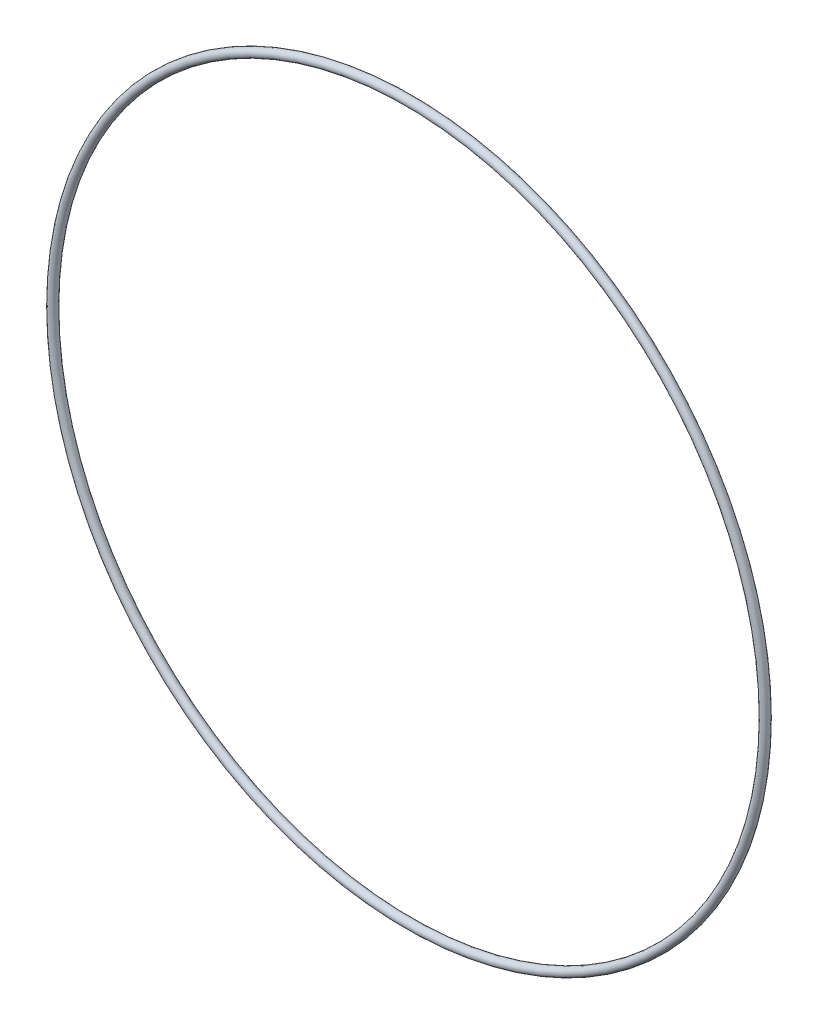
ISO-10303-21;
HEADER;
FILE_DESCRIPTION(('STEP AP214'),'2;1');
FILE_NAME('part.step','',(''),(''),'','','');
FILE_SCHEMA(('AUTOMOTIVE_DESIGN { 1 0 10303 214 1 1 1 1 }'));
ENDSEC;
DATA;
#1=APPLICATION_CONTEXT('core data for automotive mechanical design processes');
#2=APPLICATION_PROTOCOL_DEFINITION('international standard','automotive_design',2000,#1);
#3=PRODUCT_CONTEXT('',#1,'mechanical');
#4=PRODUCT('Part','Part','',(#3));
#5=PRODUCT_RELATED_PRODUCT_CATEGORY('part','',(#4));
#6=PRODUCT_DEFINITION_FORMATION('','',#4);
#7=PRODUCT_DEFINITION_CONTEXT('part definition',#1,'design');
#8=PRODUCT_DEFINITION('design','',#6,#7);
#9=PRODUCT_DEFINITION_SHAPE('','',#8);
#10=(LENGTH_UNIT() NAMED_UNIT(*) SI_UNIT(.MILLI.,.METRE.));
#11=(NAMED_UNIT(*) PLANE_ANGLE_UNIT() SI_UNIT($,.RADIAN.));
#12=(NAMED_UNIT(*) SI_UNIT($,.STERADIAN.) SOLID_ANGLE_UNIT());
#13=UNCERTAINTY_MEASURE_WITH_UNIT(LENGTH_MEASURE(1.E-05),#10,'distance_accuracy_value','');
#14=(GEOMETRIC_REPRESENTATION_CONTEXT(3) GLOBAL_UNCERTAINTY_ASSIGNED_CONTEXT((#13)) GLOBAL_UNIT_ASSIGNED_CONTEXT((#10,
#11,#12)) REPRESENTATION_CONTEXT('',''));
#15=CARTESIAN_POINT('',(0.,0.,0.));
#16=DIRECTION('',(0.,0.,1.));
#17=DIRECTION('',(1.,0.,0.));
#18=AXIS2_PLACEMENT_3D('',#15,#16,#17);
#19=CARTESIAN_POINT('',(0.,0.,0.));
#20=DIRECTION('',(0.,0.,-1.));
#21=DIRECTION('',(-1.,0.,0.));
#22=AXIS2_PLACEMENT_3D('',#19,#20,#21);
#23=TOROIDAL_SURFACE('',#22,124.,1.5);
#24=CARTESIAN_POINT('',(-125.5,0.,0.));
#25=VERTEX_POINT('',#24);
#26=VERTEX_LOOP('',#25);
#27=FACE_BOUND('',#26,.T.);
#28=ADVANCED_FACE('F35',(#27),#23,.T.);
#29=CLOSED_SHELL('',(#28));
#30=MANIFOLD_SOLID_BREP('B2',#29);
#31=ADVANCED_BREP_SHAPE_REPRESENTATION('',(#18,#30),#14);
#32=SHAPE_DEFINITION_REPRESENTATION(#9,#31);
ENDSEC;
END-ISO-10303-21;
